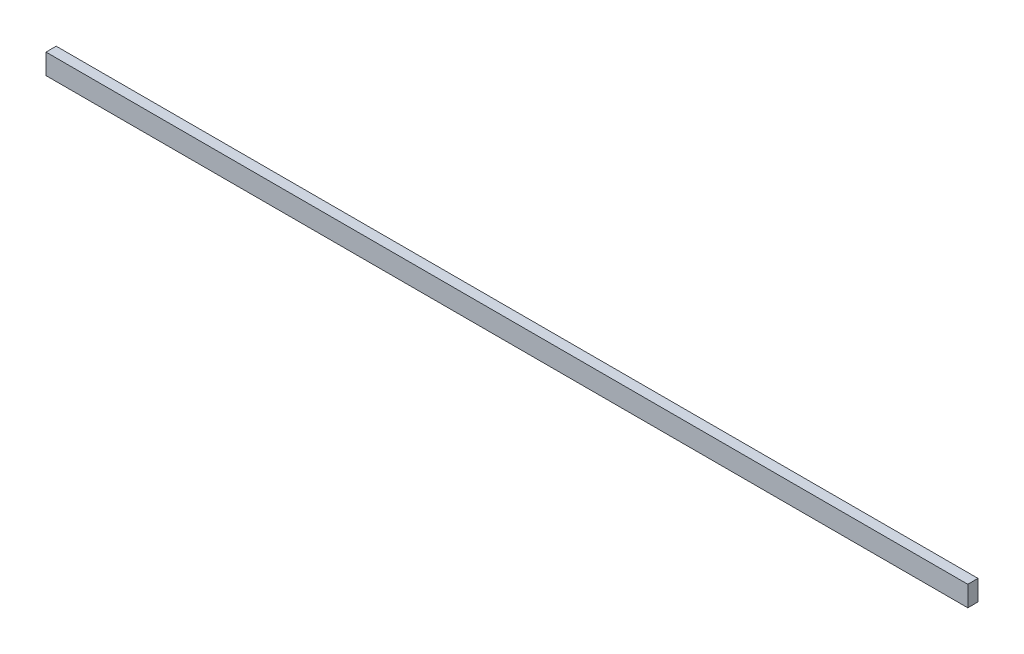
ISO-10303-21;
HEADER;
FILE_DESCRIPTION(('STEP AP214'),'2;1');
FILE_NAME('part.step','',(''),(''),'','','');
FILE_SCHEMA(('AUTOMOTIVE_DESIGN { 1 0 10303 214 1 1 1 1 }'));
ENDSEC;
DATA;
#1=APPLICATION_CONTEXT('core data for automotive mechanical design processes');
#2=APPLICATION_PROTOCOL_DEFINITION('international standard','automotive_design',2000,#1);
#3=PRODUCT_CONTEXT('',#1,'mechanical');
#4=PRODUCT('Part','Part','',(#3));
#5=PRODUCT_RELATED_PRODUCT_CATEGORY('part','',(#4));
#6=PRODUCT_DEFINITION_FORMATION('','',#4);
#7=PRODUCT_DEFINITION_CONTEXT('part definition',#1,'design');
#8=PRODUCT_DEFINITION('design','',#6,#7);
#9=PRODUCT_DEFINITION_SHAPE('','',#8);
#10=(LENGTH_UNIT() NAMED_UNIT(*) SI_UNIT(.MILLI.,.METRE.));
#11=(NAMED_UNIT(*) PLANE_ANGLE_UNIT() SI_UNIT($,.RADIAN.));
#12=(NAMED_UNIT(*) SI_UNIT($,.STERADIAN.) SOLID_ANGLE_UNIT());
#13=UNCERTAINTY_MEASURE_WITH_UNIT(LENGTH_MEASURE(1.E-05),#10,'distance_accuracy_value','');
#14=(GEOMETRIC_REPRESENTATION_CONTEXT(3) GLOBAL_UNCERTAINTY_ASSIGNED_CONTEXT((#13)) GLOBAL_UNIT_ASSIGNED_CONTEXT((#10,
#11,#12)) REPRESENTATION_CONTEXT('',''));
#15=CARTESIAN_POINT('',(0.,0.,0.));
#16=DIRECTION('',(0.,0.,1.));
#17=DIRECTION('',(1.,0.,0.));
#18=AXIS2_PLACEMENT_3D('',#15,#16,#17);
#19=CARTESIAN_POINT('',(0.,0.,6.));
#20=DIRECTION('',(0.,0.,1.));
#21=DIRECTION('',(1.,0.,0.));
#22=AXIS2_PLACEMENT_3D('',#19,#20,#21);
#23=PLANE('',#22);
#24=DIRECTION('',(-1.,0.,0.));
#25=VECTOR('',#24,1.);
#26=CARTESIAN_POINT('',(0.,-6.,6.));
#27=LINE('',#26,#25);
#28=CARTESIAN_POINT('',(271.,-6.,6.));
#29=VERTEX_POINT('',#28);
#30=CARTESIAN_POINT('',(-271.,-6.,6.));
#31=VERTEX_POINT('',#30);
#32=EDGE_CURVE('E11',#29,#31,#27,.T.);
#33=ORIENTED_EDGE('',*,*,#32,.F.);
#34=DIRECTION('',(0.,-1.,0.));
#35=VECTOR('',#34,1.);
#36=CARTESIAN_POINT('',(271.,0.,6.));
#37=LINE('',#36,#35);
#38=CARTESIAN_POINT('',(271.,6.,6.));
#39=VERTEX_POINT('',#38);
#40=EDGE_CURVE('E62',#39,#29,#37,.T.);
#41=ORIENTED_EDGE('',*,*,#40,.F.);
#42=DIRECTION('',(1.,0.,0.));
#43=VECTOR('',#42,1.);
#44=CARTESIAN_POINT('',(0.,6.,6.));
#45=LINE('',#44,#43);
#46=CARTESIAN_POINT('',(-271.,6.,6.));
#47=VERTEX_POINT('',#46);
#48=EDGE_CURVE('E98',#47,#39,#45,.T.);
#49=ORIENTED_EDGE('',*,*,#48,.F.);
#50=DIRECTION('',(0.,1.,0.));
#51=VECTOR('',#50,1.);
#52=CARTESIAN_POINT('',(-271.,0.,6.));
#53=LINE('',#52,#51);
#54=EDGE_CURVE('E25',#31,#47,#53,.T.);
#55=ORIENTED_EDGE('',*,*,#54,.F.);
#56=EDGE_LOOP('',(#33,#41,#49,#55));
#57=FACE_BOUND('',#56,.T.);
#58=ADVANCED_FACE('F17',(#57),#23,.T.);
#59=CARTESIAN_POINT('',(0.,-6.,0.));
#60=DIRECTION('',(0.,-1.,0.));
#61=DIRECTION('',(0.,0.,-1.));
#62=AXIS2_PLACEMENT_3D('',#59,#60,#61);
#63=PLANE('',#62);
#64=DIRECTION('',(0.,0.,1.));
#65=VECTOR('',#64,1.);
#66=CARTESIAN_POINT('',(271.,-6.,0.));
#67=LINE('',#66,#65);
#68=CARTESIAN_POINT('',(271.,-6.,0.));
#69=VERTEX_POINT('',#68);
#70=EDGE_CURVE('E55',#69,#29,#67,.T.);
#71=ORIENTED_EDGE('',*,*,#70,.T.);
#72=ORIENTED_EDGE('',*,*,#32,.T.);
#73=DIRECTION('',(0.,0.,1.));
#74=VECTOR('',#73,1.);
#75=CARTESIAN_POINT('',(-271.,-6.,0.));
#76=LINE('',#75,#74);
#77=CARTESIAN_POINT('',(-271.,-6.,0.));
#78=VERTEX_POINT('',#77);
#79=EDGE_CURVE('E69',#78,#31,#76,.T.);
#80=ORIENTED_EDGE('',*,*,#79,.F.);
#81=DIRECTION('',(1.,0.,0.));
#82=VECTOR('',#81,1.);
#83=CARTESIAN_POINT('',(0.,-6.,0.));
#84=LINE('',#83,#82);
#85=EDGE_CURVE('E67',#78,#69,#84,.T.);
#86=ORIENTED_EDGE('',*,*,#85,.T.);
#87=EDGE_LOOP('',(#71,#72,#80,#86));
#88=FACE_BOUND('',#87,.T.);
#89=ADVANCED_FACE('F68',(#88),#63,.T.);
#90=CARTESIAN_POINT('',(-271.,0.,0.));
#91=DIRECTION('',(-1.,0.,0.));
#92=DIRECTION('',(0.,0.,1.));
#93=AXIS2_PLACEMENT_3D('',#90,#91,#92);
#94=PLANE('',#93);
#95=ORIENTED_EDGE('',*,*,#79,.T.);
#96=ORIENTED_EDGE('',*,*,#54,.T.);
#97=DIRECTION('',(0.,0.,1.));
#98=VECTOR('',#97,1.);
#99=CARTESIAN_POINT('',(-271.,6.,0.));
#100=LINE('',#99,#98);
#101=CARTESIAN_POINT('',(-271.,6.,0.));
#102=VERTEX_POINT('',#101);
#103=EDGE_CURVE('E90',#102,#47,#100,.T.);
#104=ORIENTED_EDGE('',*,*,#103,.F.);
#105=DIRECTION('',(0.,-1.,0.));
#106=VECTOR('',#105,1.);
#107=CARTESIAN_POINT('',(-271.,0.,0.));
#108=LINE('',#107,#106);
#109=EDGE_CURVE('E74',#102,#78,#108,.T.);
#110=ORIENTED_EDGE('',*,*,#109,.T.);
#111=EDGE_LOOP('',(#95,#96,#104,#110));
#112=FACE_BOUND('',#111,.T.);
#113=ADVANCED_FACE('F106',(#112),#94,.T.);
#114=CARTESIAN_POINT('',(0.,6.,0.));
#115=DIRECTION('',(0.,1.,0.));
#116=DIRECTION('',(0.,0.,1.));
#117=AXIS2_PLACEMENT_3D('',#114,#115,#116);
#118=PLANE('',#117);
#119=ORIENTED_EDGE('',*,*,#103,.T.);
#120=ORIENTED_EDGE('',*,*,#48,.T.);
#121=DIRECTION('',(0.,0.,1.));
#122=VECTOR('',#121,1.);
#123=CARTESIAN_POINT('',(271.,6.,0.));
#124=LINE('',#123,#122);
#125=CARTESIAN_POINT('',(271.,6.,0.));
#126=VERTEX_POINT('',#125);
#127=EDGE_CURVE('E64',#126,#39,#124,.T.);
#128=ORIENTED_EDGE('',*,*,#127,.F.);
#129=DIRECTION('',(-1.,0.,0.));
#130=VECTOR('',#129,1.);
#131=CARTESIAN_POINT('',(0.,6.,0.));
#132=LINE('',#131,#130);
#133=EDGE_CURVE('E79',#126,#102,#132,.T.);
#134=ORIENTED_EDGE('',*,*,#133,.T.);
#135=EDGE_LOOP('',(#119,#120,#128,#134));
#136=FACE_BOUND('',#135,.T.);
#137=ADVANCED_FACE('F104',(#136),#118,.T.);
#138=CARTESIAN_POINT('',(0.,0.,0.));
#139=DIRECTION('',(0.,0.,-1.));
#140=DIRECTION('',(-1.,0.,0.));
#141=AXIS2_PLACEMENT_3D('',#138,#139,#140);
#142=PLANE('',#141);
#143=DIRECTION('',(0.,1.,0.));
#144=VECTOR('',#143,1.);
#145=CARTESIAN_POINT('',(271.,0.,0.));
#146=LINE('',#145,#144);
#147=EDGE_CURVE('E60',#69,#126,#146,.T.);
#148=ORIENTED_EDGE('',*,*,#147,.F.);
#149=ORIENTED_EDGE('',*,*,#85,.F.);
#150=ORIENTED_EDGE('',*,*,#109,.F.);
#151=ORIENTED_EDGE('',*,*,#133,.F.);
#152=EDGE_LOOP('',(#148,#149,#150,#151));
#153=FACE_BOUND('',#152,.T.);
#154=ADVANCED_FACE('F77',(#153),#142,.T.);
#155=CARTESIAN_POINT('',(271.,0.,0.));
#156=DIRECTION('',(1.,0.,0.));
#157=DIRECTION('',(0.,0.,-1.));
#158=AXIS2_PLACEMENT_3D('',#155,#156,#157);
#159=PLANE('',#158);
#160=ORIENTED_EDGE('',*,*,#147,.T.);
#161=ORIENTED_EDGE('',*,*,#127,.T.);
#162=ORIENTED_EDGE('',*,*,#40,.T.);
#163=ORIENTED_EDGE('',*,*,#70,.F.);
#164=EDGE_LOOP('',(#160,#161,#162,#163));
#165=FACE_BOUND('',#164,.T.);
#166=ADVANCED_FACE('F57',(#165),#159,.T.);
#167=CLOSED_SHELL('',(#58,#89,#113,#137,#154,#166));
#168=MANIFOLD_SOLID_BREP('B1',#167);
#169=ADVANCED_BREP_SHAPE_REPRESENTATION('',(#18,#168),#14);
#170=SHAPE_DEFINITION_REPRESENTATION(#9,#169);
ENDSEC;
END-ISO-10303-21;
